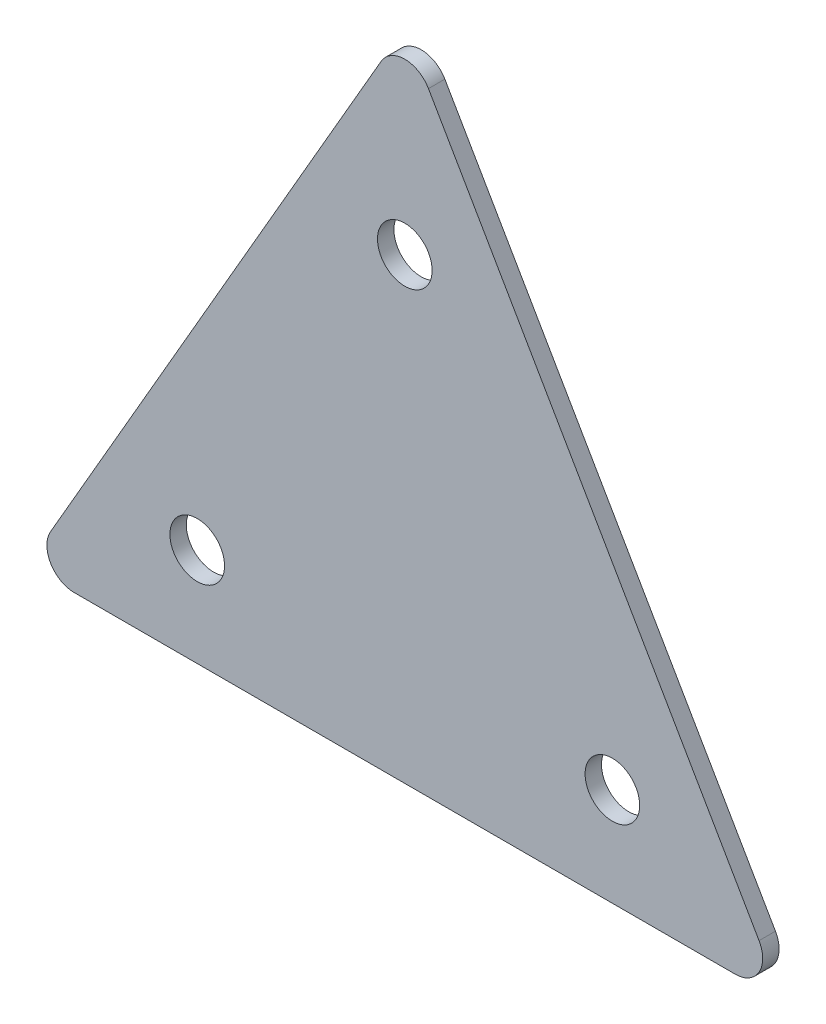
ISO-10303-21;
HEADER;
FILE_DESCRIPTION(('STEP AP214'),'2;1');
FILE_NAME('part.step','',(''),(''),'','','');
FILE_SCHEMA(('AUTOMOTIVE_DESIGN { 1 0 10303 214 1 1 1 1 }'));
ENDSEC;
DATA;
#1=APPLICATION_CONTEXT('core data for automotive mechanical design processes');
#2=APPLICATION_PROTOCOL_DEFINITION('international standard','automotive_design',2000,#1);
#3=PRODUCT_CONTEXT('',#1,'mechanical');
#4=PRODUCT('Part','Part','',(#3));
#5=PRODUCT_RELATED_PRODUCT_CATEGORY('part','',(#4));
#6=PRODUCT_DEFINITION_FORMATION('','',#4);
#7=PRODUCT_DEFINITION_CONTEXT('part definition',#1,'design');
#8=PRODUCT_DEFINITION('design','',#6,#7);
#9=PRODUCT_DEFINITION_SHAPE('','',#8);
#10=(LENGTH_UNIT() NAMED_UNIT(*) SI_UNIT(.MILLI.,.METRE.));
#11=(NAMED_UNIT(*) PLANE_ANGLE_UNIT() SI_UNIT($,.RADIAN.));
#12=(NAMED_UNIT(*) SI_UNIT($,.STERADIAN.) SOLID_ANGLE_UNIT());
#13=UNCERTAINTY_MEASURE_WITH_UNIT(LENGTH_MEASURE(1.E-05),#10,'distance_accuracy_value','');
#14=(GEOMETRIC_REPRESENTATION_CONTEXT(3) GLOBAL_UNCERTAINTY_ASSIGNED_CONTEXT((#13)) GLOBAL_UNIT_ASSIGNED_CONTEXT((#10,
#11,#12)) REPRESENTATION_CONTEXT('',''));
#15=CARTESIAN_POINT('',(0.,0.,0.));
#16=DIRECTION('',(0.,0.,1.));
#17=DIRECTION('',(1.,0.,0.));
#18=AXIS2_PLACEMENT_3D('',#15,#16,#17);
#19=CARTESIAN_POINT('',(0.,0.,1.5));
#20=DIRECTION('',(0.,0.,1.));
#21=DIRECTION('',(1.,0.,0.));
#22=AXIS2_PLACEMENT_3D('',#19,#20,#21);
#23=PLANE('',#22);
#24=CARTESIAN_POINT('',(20.8315186122816,0.,1.5));
#25=DIRECTION('',(0.,0.,1.));
#26=DIRECTION('',(1.,0.,0.));
#27=AXIS2_PLACEMENT_3D('',#24,#25,#26);
#28=CIRCLE('',#27,2.5);
#29=CARTESIAN_POINT('',(23.3315186122816,0.,1.5));
#30=VERTEX_POINT('',#29);
#31=EDGE_CURVE('E144',#30,#30,#28,.T.);
#32=ORIENTED_EDGE('',*,*,#31,.F.);
#33=EDGE_LOOP('',(#32));
#34=FACE_BOUND('',#33,.T.);
#35=DIRECTION('',(1.,0.,0.));
#36=VECTOR('',#35,1.);
#37=CARTESIAN_POINT('',(-32.7569386558383,-9.00000000000001,1.5));
#38=LINE('',#37,#36);
#39=CARTESIAN_POINT('',(-28.4268116369161,-9.00000000000001,1.5));
#40=VERTEX_POINT('',#39);
#41=CARTESIAN_POINT('',(32.0898488614793,-9.,1.5));
#42=VERTEX_POINT('',#41);
#43=EDGE_CURVE('E115',#40,#42,#38,.T.);
#44=ORIENTED_EDGE('',*,*,#43,.T.);
#45=CARTESIAN_POINT('',(32.0898488614793,-6.5,1.5));
#46=DIRECTION('',(0.,0.,1.));
#47=DIRECTION('',(1.,0.,0.));
#48=AXIS2_PLACEMENT_3D('',#45,#46,#47);
#49=CIRCLE('',#48,2.5);
#50=CARTESIAN_POINT('',(34.2549123709404,-5.25,1.5));
#51=VERTEX_POINT('',#50);
#52=EDGE_CURVE('E130',#42,#51,#49,.T.);
#53=ORIENTED_EDGE('',*,*,#52,.T.);
#54=DIRECTION('',(-0.5,0.866025403784439,0.));
#55=VECTOR('',#54,1.);
#56=CARTESIAN_POINT('',(36.4199758804015,-9.,1.5));
#57=LINE('',#56,#55);
#58=CARTESIAN_POINT('',(3.99658212174272,47.1589653438087,1.5));
#59=VERTEX_POINT('',#58);
#60=EDGE_CURVE('E105',#51,#59,#57,.T.);
#61=ORIENTED_EDGE('',*,*,#60,.T.);
#62=CARTESIAN_POINT('',(1.83151861228162,45.9089653438087,1.5));
#63=DIRECTION('',(0.,0.,1.));
#64=DIRECTION('',(1.,0.,0.));
#65=AXIS2_PLACEMENT_3D('',#62,#63,#64);
#66=CIRCLE('',#65,2.5);
#67=CARTESIAN_POINT('',(-0.333544897179472,47.1589653438087,1.5));
#68=VERTEX_POINT('',#67);
#69=EDGE_CURVE('E53',#59,#68,#66,.T.);
#70=ORIENTED_EDGE('',*,*,#69,.T.);
#71=DIRECTION('',(-0.5,-0.866025403784439,0.));
#72=VECTOR('',#71,1.);
#73=CARTESIAN_POINT('',(1.83151861228162,50.9089653438087,1.5));
#74=LINE('',#73,#72);
#75=CARTESIAN_POINT('',(-30.5918751463772,-5.25000000000001,1.5));
#76=VERTEX_POINT('',#75);
#77=EDGE_CURVE('E112',#68,#76,#74,.T.);
#78=ORIENTED_EDGE('',*,*,#77,.T.);
#79=CARTESIAN_POINT('',(-28.4268116369161,-6.50000000000001,1.5));
#80=DIRECTION('',(0.,0.,1.));
#81=DIRECTION('',(1.,0.,0.));
#82=AXIS2_PLACEMENT_3D('',#79,#80,#81);
#83=CIRCLE('',#82,2.5);
#84=EDGE_CURVE('E128',#76,#40,#83,.T.);
#85=ORIENTED_EDGE('',*,*,#84,.T.);
#86=EDGE_LOOP('',(#44,#53,#61,#70,#78,#85));
#87=FACE_BOUND('',#86,.T.);
#88=CARTESIAN_POINT('',(-17.1684813877184,0.,1.5));
#89=DIRECTION('',(0.,0.,1.));
#90=DIRECTION('',(1.,0.,0.));
#91=AXIS2_PLACEMENT_3D('',#88,#89,#90);
#92=CIRCLE('',#91,2.5);
#93=CARTESIAN_POINT('',(-14.6684813877184,0.,1.5));
#94=VERTEX_POINT('',#93);
#95=EDGE_CURVE('E135',#94,#94,#92,.T.);
#96=ORIENTED_EDGE('',*,*,#95,.F.);
#97=EDGE_LOOP('',(#96));
#98=FACE_BOUND('',#97,.T.);
#99=CARTESIAN_POINT('',(1.83151861228162,32.9089653438087,1.5));
#100=DIRECTION('',(0.,0.,1.));
#101=DIRECTION('',(1.,0.,0.));
#102=AXIS2_PLACEMENT_3D('',#99,#100,#101);
#103=CIRCLE('',#102,2.5);
#104=CARTESIAN_POINT('',(4.33151861228162,32.9089653438087,1.5));
#105=VERTEX_POINT('',#104);
#106=EDGE_CURVE('E149',#105,#105,#103,.T.);
#107=ORIENTED_EDGE('',*,*,#106,.F.);
#108=EDGE_LOOP('',(#107));
#109=FACE_BOUND('',#108,.T.);
#110=ADVANCED_FACE('F33',(#34,#87,#98,#109),#23,.T.);
#111=CARTESIAN_POINT('',(0.,0.,0.));
#112=DIRECTION('',(0.,0.,1.));
#113=DIRECTION('',(1.,0.,0.));
#114=AXIS2_PLACEMENT_3D('',#111,#112,#113);
#115=PLANE('',#114);
#116=DIRECTION('',(-0.5,0.866025403784439,0.));
#117=VECTOR('',#116,1.);
#118=CARTESIAN_POINT('',(36.4199758804015,-9.,0.));
#119=LINE('',#118,#117);
#120=CARTESIAN_POINT('',(34.2549123709404,-5.25,0.));
#121=VERTEX_POINT('',#120);
#122=CARTESIAN_POINT('',(3.99658212174272,47.1589653438087,0.));
#123=VERTEX_POINT('',#122);
#124=EDGE_CURVE('E103',#121,#123,#119,.T.);
#125=ORIENTED_EDGE('',*,*,#124,.F.);
#126=CARTESIAN_POINT('',(32.0898488614793,-6.5,0.));
#127=DIRECTION('',(0.,0.,1.));
#128=DIRECTION('',(1.,0.,0.));
#129=AXIS2_PLACEMENT_3D('',#126,#127,#128);
#130=CIRCLE('',#129,2.5);
#131=CARTESIAN_POINT('',(32.0898488614793,-9.,0.));
#132=VERTEX_POINT('',#131);
#133=EDGE_CURVE('E86',#121,#132,#130,.F.);
#134=ORIENTED_EDGE('',*,*,#133,.T.);
#135=DIRECTION('',(1.,0.,0.));
#136=VECTOR('',#135,1.);
#137=CARTESIAN_POINT('',(-32.7569386558383,-9.00000000000001,0.));
#138=LINE('',#137,#136);
#139=CARTESIAN_POINT('',(-28.4268116369161,-9.00000000000001,0.));
#140=VERTEX_POINT('',#139);
#141=EDGE_CURVE('E113',#140,#132,#138,.T.);
#142=ORIENTED_EDGE('',*,*,#141,.F.);
#143=CARTESIAN_POINT('',(-28.4268116369161,-6.50000000000001,0.));
#144=DIRECTION('',(0.,0.,1.));
#145=DIRECTION('',(1.,0.,0.));
#146=AXIS2_PLACEMENT_3D('',#143,#144,#145);
#147=CIRCLE('',#146,2.5);
#148=CARTESIAN_POINT('',(-30.5918751463772,-5.25000000000001,0.));
#149=VERTEX_POINT('',#148);
#150=EDGE_CURVE('E97',#140,#149,#147,.F.);
#151=ORIENTED_EDGE('',*,*,#150,.T.);
#152=DIRECTION('',(-0.5,-0.866025403784439,0.));
#153=VECTOR('',#152,1.);
#154=CARTESIAN_POINT('',(1.83151861228162,50.9089653438087,0.));
#155=LINE('',#154,#153);
#156=CARTESIAN_POINT('',(-0.333544897179472,47.1589653438087,0.));
#157=VERTEX_POINT('',#156);
#158=EDGE_CURVE('E117',#157,#149,#155,.T.);
#159=ORIENTED_EDGE('',*,*,#158,.F.);
#160=CARTESIAN_POINT('',(1.83151861228162,45.9089653438087,0.));
#161=DIRECTION('',(0.,0.,1.));
#162=DIRECTION('',(1.,0.,0.));
#163=AXIS2_PLACEMENT_3D('',#160,#161,#162);
#164=CIRCLE('',#163,2.5);
#165=EDGE_CURVE('E106',#157,#123,#164,.F.);
#166=ORIENTED_EDGE('',*,*,#165,.T.);
#167=EDGE_LOOP('',(#125,#134,#142,#151,#159,#166));
#168=FACE_BOUND('',#167,.T.);
#169=CARTESIAN_POINT('',(-17.1684813877184,0.,0.));
#170=DIRECTION('',(0.,0.,1.));
#171=DIRECTION('',(1.,0.,0.));
#172=AXIS2_PLACEMENT_3D('',#169,#170,#171);
#173=CIRCLE('',#172,2.5);
#174=CARTESIAN_POINT('',(-14.6684813877184,0.,0.));
#175=VERTEX_POINT('',#174);
#176=EDGE_CURVE('E137',#175,#175,#173,.T.);
#177=ORIENTED_EDGE('',*,*,#176,.T.);
#178=EDGE_LOOP('',(#177));
#179=FACE_BOUND('',#178,.T.);
#180=CARTESIAN_POINT('',(20.8315186122816,0.,0.));
#181=DIRECTION('',(0.,0.,1.));
#182=DIRECTION('',(1.,0.,0.));
#183=AXIS2_PLACEMENT_3D('',#180,#181,#182);
#184=CIRCLE('',#183,2.5);
#185=CARTESIAN_POINT('',(23.3315186122816,0.,0.));
#186=VERTEX_POINT('',#185);
#187=EDGE_CURVE('E146',#186,#186,#184,.T.);
#188=ORIENTED_EDGE('',*,*,#187,.T.);
#189=EDGE_LOOP('',(#188));
#190=FACE_BOUND('',#189,.T.);
#191=CARTESIAN_POINT('',(1.83151861228162,32.9089653438087,0.));
#192=DIRECTION('',(0.,0.,1.));
#193=DIRECTION('',(1.,0.,0.));
#194=AXIS2_PLACEMENT_3D('',#191,#192,#193);
#195=CIRCLE('',#194,2.5);
#196=CARTESIAN_POINT('',(4.33151861228162,32.9089653438087,0.));
#197=VERTEX_POINT('',#196);
#198=EDGE_CURVE('E152',#197,#197,#195,.T.);
#199=ORIENTED_EDGE('',*,*,#198,.T.);
#200=EDGE_LOOP('',(#199));
#201=FACE_BOUND('',#200,.T.);
#202=ADVANCED_FACE('F109',(#168,#179,#190,#201),#115,.F.);
#203=CARTESIAN_POINT('',(1.83151861228162,50.9089653438087,1.5));
#204=DIRECTION('',(0.866025403784439,-0.5,0.));
#205=DIRECTION('',(0.5,0.866025403784439,0.));
#206=AXIS2_PLACEMENT_3D('',#203,#204,#205);
#207=PLANE('',#206);
#208=ORIENTED_EDGE('',*,*,#158,.T.);
#209=DIRECTION('',(0.,0.,-1.));
#210=VECTOR('',#209,1.);
#211=CARTESIAN_POINT('',(-30.5918751463772,-5.25,1.5));
#212=LINE('',#211,#210);
#213=EDGE_CURVE('E11',#149,#76,#212,.F.);
#214=ORIENTED_EDGE('',*,*,#213,.T.);
#215=ORIENTED_EDGE('',*,*,#77,.F.);
#216=DIRECTION('',(0.,0.,-1.));
#217=VECTOR('',#216,1.);
#218=CARTESIAN_POINT('',(-0.333544897179472,47.1589653438087,1.5));
#219=LINE('',#218,#217);
#220=EDGE_CURVE('E41',#68,#157,#219,.T.);
#221=ORIENTED_EDGE('',*,*,#220,.T.);
#222=EDGE_LOOP('',(#208,#214,#215,#221));
#223=FACE_BOUND('',#222,.T.);
#224=ADVANCED_FACE('F133',(#223),#207,.F.);
#225=CARTESIAN_POINT('',(-32.7569386558383,-9.00000000000001,1.5));
#226=DIRECTION('',(0.,1.,0.));
#227=DIRECTION('',(-1.,0.,0.));
#228=AXIS2_PLACEMENT_3D('',#225,#226,#227);
#229=PLANE('',#228);
#230=ORIENTED_EDGE('',*,*,#141,.T.);
#231=DIRECTION('',(0.,0.,-1.));
#232=VECTOR('',#231,1.);
#233=CARTESIAN_POINT('',(32.0898488614793,-9.,1.5));
#234=LINE('',#233,#232);
#235=EDGE_CURVE('E91',#132,#42,#234,.F.);
#236=ORIENTED_EDGE('',*,*,#235,.T.);
#237=ORIENTED_EDGE('',*,*,#43,.F.);
#238=DIRECTION('',(0.,0.,-1.));
#239=VECTOR('',#238,1.);
#240=CARTESIAN_POINT('',(-28.4268116369161,-9.00000000000001,1.5));
#241=LINE('',#240,#239);
#242=EDGE_CURVE('E96',#40,#140,#241,.T.);
#243=ORIENTED_EDGE('',*,*,#242,.T.);
#244=EDGE_LOOP('',(#230,#236,#237,#243));
#245=FACE_BOUND('',#244,.T.);
#246=ADVANCED_FACE('F175',(#245),#229,.F.);
#247=CARTESIAN_POINT('',(36.4199758804015,-9.,1.5));
#248=DIRECTION('',(-0.866025403784439,-0.5,0.));
#249=DIRECTION('',(0.5,-0.866025403784439,0.));
#250=AXIS2_PLACEMENT_3D('',#247,#248,#249);
#251=PLANE('',#250);
#252=ORIENTED_EDGE('',*,*,#60,.F.);
#253=DIRECTION('',(0.,0.,-1.));
#254=VECTOR('',#253,1.);
#255=CARTESIAN_POINT('',(34.2549123709404,-5.25,1.5));
#256=LINE('',#255,#254);
#257=EDGE_CURVE('E90',#51,#121,#256,.T.);
#258=ORIENTED_EDGE('',*,*,#257,.T.);
#259=ORIENTED_EDGE('',*,*,#124,.T.);
#260=DIRECTION('',(0.,0.,-1.));
#261=VECTOR('',#260,1.);
#262=CARTESIAN_POINT('',(3.99658212174272,47.1589653438087,1.5));
#263=LINE('',#262,#261);
#264=EDGE_CURVE('E107',#123,#59,#263,.F.);
#265=ORIENTED_EDGE('',*,*,#264,.T.);
#266=EDGE_LOOP('',(#252,#258,#259,#265));
#267=FACE_BOUND('',#266,.T.);
#268=ADVANCED_FACE('F102',(#267),#251,.F.);
#269=CARTESIAN_POINT('',(-17.1684813877184,0.,1.5));
#270=DIRECTION('',(0.,0.,-1.));
#271=DIRECTION('',(-1.,0.,0.));
#272=AXIS2_PLACEMENT_3D('',#269,#270,#271);
#273=CYLINDRICAL_SURFACE('',#272,2.5);
#274=ORIENTED_EDGE('',*,*,#95,.T.);
#275=EDGE_LOOP('',(#274));
#276=FACE_BOUND('',#275,.T.);
#277=ORIENTED_EDGE('',*,*,#176,.F.);
#278=EDGE_LOOP('',(#277));
#279=FACE_BOUND('',#278,.T.);
#280=ADVANCED_FACE('F170',(#276,#279),#273,.F.);
#281=CARTESIAN_POINT('',(20.8315186122816,0.,1.5));
#282=DIRECTION('',(0.,0.,-1.));
#283=DIRECTION('',(-1.,0.,0.));
#284=AXIS2_PLACEMENT_3D('',#281,#282,#283);
#285=CYLINDRICAL_SURFACE('',#284,2.5);
#286=ORIENTED_EDGE('',*,*,#31,.T.);
#287=EDGE_LOOP('',(#286));
#288=FACE_BOUND('',#287,.T.);
#289=ORIENTED_EDGE('',*,*,#187,.F.);
#290=EDGE_LOOP('',(#289));
#291=FACE_BOUND('',#290,.T.);
#292=ADVANCED_FACE('F196',(#288,#291),#285,.F.);
#293=CARTESIAN_POINT('',(1.83151861228162,32.9089653438087,1.5));
#294=DIRECTION('',(0.,0.,-1.));
#295=DIRECTION('',(-1.,0.,0.));
#296=AXIS2_PLACEMENT_3D('',#293,#294,#295);
#297=CYLINDRICAL_SURFACE('',#296,2.5);
#298=ORIENTED_EDGE('',*,*,#106,.T.);
#299=EDGE_LOOP('',(#298));
#300=FACE_BOUND('',#299,.T.);
#301=ORIENTED_EDGE('',*,*,#198,.F.);
#302=EDGE_LOOP('',(#301));
#303=FACE_BOUND('',#302,.T.);
#304=ADVANCED_FACE('F158',(#300,#303),#297,.F.);
#305=CARTESIAN_POINT('',(32.0898488614793,-6.5,1.5));
#306=DIRECTION('',(0.,0.,-1.));
#307=DIRECTION('',(-1.,0.,0.));
#308=AXIS2_PLACEMENT_3D('',#305,#306,#307);
#309=CYLINDRICAL_SURFACE('',#308,2.5);
#310=ORIENTED_EDGE('',*,*,#52,.F.);
#311=ORIENTED_EDGE('',*,*,#235,.F.);
#312=ORIENTED_EDGE('',*,*,#133,.F.);
#313=ORIENTED_EDGE('',*,*,#257,.F.);
#314=EDGE_LOOP('',(#310,#311,#312,#313));
#315=FACE_BOUND('',#314,.T.);
#316=ADVANCED_FACE('F89',(#315),#309,.T.);
#317=CARTESIAN_POINT('',(-28.4268116369161,-6.50000000000001,1.5));
#318=DIRECTION('',(0.,0.,-1.));
#319=DIRECTION('',(-1.,0.,0.));
#320=AXIS2_PLACEMENT_3D('',#317,#318,#319);
#321=CYLINDRICAL_SURFACE('',#320,2.5);
#322=ORIENTED_EDGE('',*,*,#84,.F.);
#323=ORIENTED_EDGE('',*,*,#213,.F.);
#324=ORIENTED_EDGE('',*,*,#150,.F.);
#325=ORIENTED_EDGE('',*,*,#242,.F.);
#326=EDGE_LOOP('',(#322,#323,#324,#325));
#327=FACE_BOUND('',#326,.T.);
#328=ADVANCED_FACE('F182',(#327),#321,.T.);
#329=CARTESIAN_POINT('',(1.83151861228162,45.9089653438087,1.5));
#330=DIRECTION('',(0.,0.,-1.));
#331=DIRECTION('',(-1.,0.,0.));
#332=AXIS2_PLACEMENT_3D('',#329,#330,#331);
#333=CYLINDRICAL_SURFACE('',#332,2.5);
#334=ORIENTED_EDGE('',*,*,#69,.F.);
#335=ORIENTED_EDGE('',*,*,#264,.F.);
#336=ORIENTED_EDGE('',*,*,#165,.F.);
#337=ORIENTED_EDGE('',*,*,#220,.F.);
#338=EDGE_LOOP('',(#334,#335,#336,#337));
#339=FACE_BOUND('',#338,.T.);
#340=ADVANCED_FACE('F35',(#339),#333,.T.);
#341=CLOSED_SHELL('',(#110,#202,#224,#246,#268,#280,#292,#304,#316,#328,#340));
#342=MANIFOLD_SOLID_BREP('B2',#341);
#343=ADVANCED_BREP_SHAPE_REPRESENTATION('',(#18,#342),#14);
#344=SHAPE_DEFINITION_REPRESENTATION(#9,#343);
ENDSEC;
END-ISO-10303-21;
